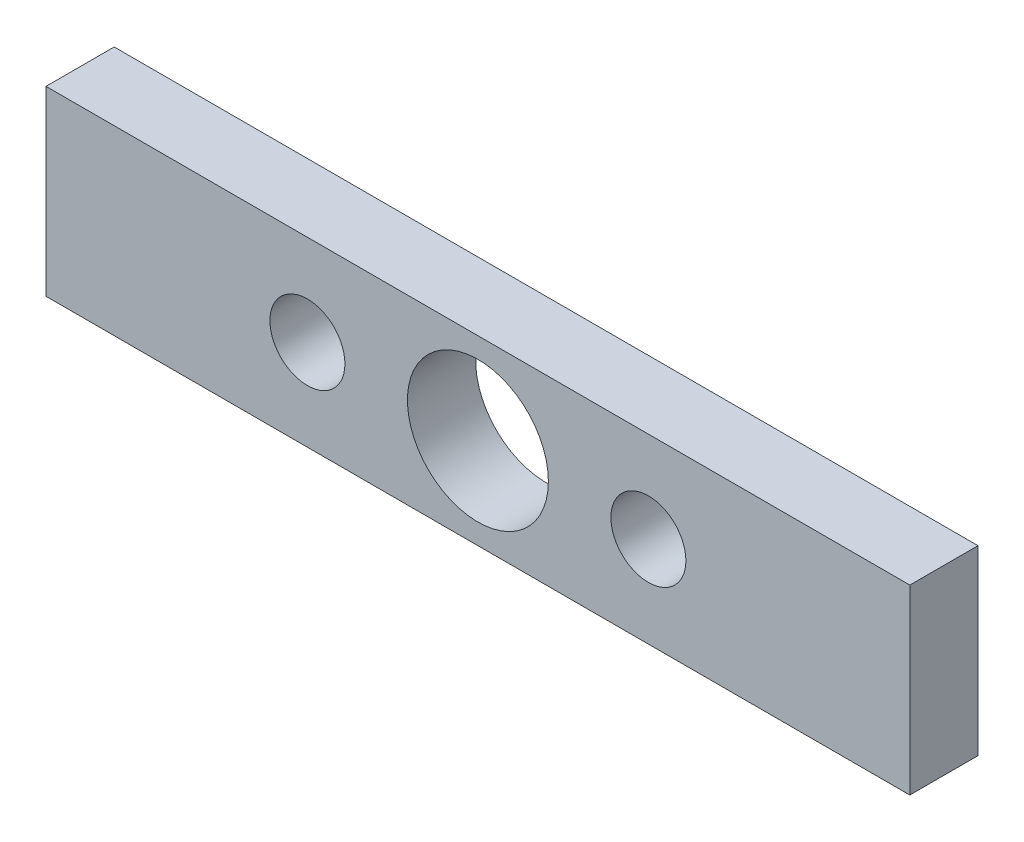
ISO-10303-21;
HEADER;
FILE_DESCRIPTION(('STEP AP214'),'2;1');
FILE_NAME('part.step','',(''),(''),'','','');
FILE_SCHEMA(('AUTOMOTIVE_DESIGN { 1 0 10303 214 1 1 1 1 }'));
ENDSEC;
DATA;
#1=APPLICATION_CONTEXT('core data for automotive mechanical design processes');
#2=APPLICATION_PROTOCOL_DEFINITION('international standard','automotive_design',2000,#1);
#3=PRODUCT_CONTEXT('',#1,'mechanical');
#4=PRODUCT('Part','Part','',(#3));
#5=PRODUCT_RELATED_PRODUCT_CATEGORY('part','',(#4));
#6=PRODUCT_DEFINITION_FORMATION('','',#4);
#7=PRODUCT_DEFINITION_CONTEXT('part definition',#1,'design');
#8=PRODUCT_DEFINITION('design','',#6,#7);
#9=PRODUCT_DEFINITION_SHAPE('','',#8);
#10=(LENGTH_UNIT() NAMED_UNIT(*) SI_UNIT(.MILLI.,.METRE.));
#11=(NAMED_UNIT(*) PLANE_ANGLE_UNIT() SI_UNIT($,.RADIAN.));
#12=(NAMED_UNIT(*) SI_UNIT($,.STERADIAN.) SOLID_ANGLE_UNIT());
#13=UNCERTAINTY_MEASURE_WITH_UNIT(LENGTH_MEASURE(1.E-05),#10,'distance_accuracy_value','');
#14=(GEOMETRIC_REPRESENTATION_CONTEXT(3) GLOBAL_UNCERTAINTY_ASSIGNED_CONTEXT((#13)) GLOBAL_UNIT_ASSIGNED_CONTEXT((#10,
#11,#12)) REPRESENTATION_CONTEXT('',''));
#15=CARTESIAN_POINT('',(0.,0.,0.));
#16=DIRECTION('',(0.,0.,1.));
#17=DIRECTION('',(1.,0.,0.));
#18=AXIS2_PLACEMENT_3D('',#15,#16,#17);
#19=CARTESIAN_POINT('',(-19.,0.,3.));
#20=DIRECTION('',(1.,0.,0.));
#21=DIRECTION('',(0.,0.,-1.));
#22=AXIS2_PLACEMENT_3D('',#19,#20,#21);
#23=PLANE('',#22);
#24=DIRECTION('',(0.,-1.,0.));
#25=VECTOR('',#24,1.);
#26=CARTESIAN_POINT('',(-19.,0.,0.));
#27=LINE('',#26,#25);
#28=CARTESIAN_POINT('',(-19.,8.,0.));
#29=VERTEX_POINT('',#28);
#30=CARTESIAN_POINT('',(-19.,0.,0.));
#31=VERTEX_POINT('',#30);
#32=EDGE_CURVE('E95',#29,#31,#27,.T.);
#33=ORIENTED_EDGE('',*,*,#32,.T.);
#34=DIRECTION('',(0.,0.,-1.));
#35=VECTOR('',#34,1.);
#36=CARTESIAN_POINT('',(-19.,0.,3.));
#37=LINE('',#36,#35);
#38=CARTESIAN_POINT('',(-19.,0.,3.));
#39=VERTEX_POINT('',#38);
#40=EDGE_CURVE('E11',#39,#31,#37,.T.);
#41=ORIENTED_EDGE('',*,*,#40,.F.);
#42=DIRECTION('',(0.,-1.,0.));
#43=VECTOR('',#42,1.);
#44=CARTESIAN_POINT('',(-19.,0.,3.));
#45=LINE('',#44,#43);
#46=CARTESIAN_POINT('',(-19.,8.,3.));
#47=VERTEX_POINT('',#46);
#48=EDGE_CURVE('E83',#47,#39,#45,.T.);
#49=ORIENTED_EDGE('',*,*,#48,.F.);
#50=DIRECTION('',(0.,0.,-1.));
#51=VECTOR('',#50,1.);
#52=CARTESIAN_POINT('',(-19.,8.,3.));
#53=LINE('',#52,#51);
#54=EDGE_CURVE('E91',#47,#29,#53,.T.);
#55=ORIENTED_EDGE('',*,*,#54,.T.);
#56=EDGE_LOOP('',(#33,#41,#49,#55));
#57=FACE_BOUND('',#56,.T.);
#58=ADVANCED_FACE('F32',(#57),#23,.F.);
#59=CARTESIAN_POINT('',(-19.,0.,3.));
#60=DIRECTION('',(0.,1.,0.));
#61=DIRECTION('',(0.,0.,1.));
#62=AXIS2_PLACEMENT_3D('',#59,#60,#61);
#63=PLANE('',#62);
#64=DIRECTION('',(1.,0.,0.));
#65=VECTOR('',#64,1.);
#66=CARTESIAN_POINT('',(-19.,0.,0.));
#67=LINE('',#66,#65);
#68=CARTESIAN_POINT('',(19.,0.,0.));
#69=VERTEX_POINT('',#68);
#70=EDGE_CURVE('E87',#31,#69,#67,.T.);
#71=ORIENTED_EDGE('',*,*,#70,.T.);
#72=DIRECTION('',(0.,0.,-1.));
#73=VECTOR('',#72,1.);
#74=CARTESIAN_POINT('',(19.,0.,3.));
#75=LINE('',#74,#73);
#76=CARTESIAN_POINT('',(19.,0.,3.));
#77=VERTEX_POINT('',#76);
#78=EDGE_CURVE('E40',#77,#69,#75,.T.);
#79=ORIENTED_EDGE('',*,*,#78,.F.);
#80=DIRECTION('',(1.,0.,0.));
#81=VECTOR('',#80,1.);
#82=CARTESIAN_POINT('',(-19.,0.,3.));
#83=LINE('',#82,#81);
#84=EDGE_CURVE('E78',#39,#77,#83,.T.);
#85=ORIENTED_EDGE('',*,*,#84,.F.);
#86=ORIENTED_EDGE('',*,*,#40,.T.);
#87=EDGE_LOOP('',(#71,#79,#85,#86));
#88=FACE_BOUND('',#87,.T.);
#89=ADVANCED_FACE('F86',(#88),#63,.F.);
#90=CARTESIAN_POINT('',(19.,0.,3.));
#91=DIRECTION('',(-1.,0.,0.));
#92=DIRECTION('',(0.,0.,1.));
#93=AXIS2_PLACEMENT_3D('',#90,#91,#92);
#94=PLANE('',#93);
#95=DIRECTION('',(0.,1.,0.));
#96=VECTOR('',#95,1.);
#97=CARTESIAN_POINT('',(19.,0.,0.));
#98=LINE('',#97,#96);
#99=CARTESIAN_POINT('',(19.,8.,0.));
#100=VERTEX_POINT('',#99);
#101=EDGE_CURVE('E65',#69,#100,#98,.T.);
#102=ORIENTED_EDGE('',*,*,#101,.T.);
#103=DIRECTION('',(0.,0.,-1.));
#104=VECTOR('',#103,1.);
#105=CARTESIAN_POINT('',(19.,8.,3.));
#106=LINE('',#105,#104);
#107=CARTESIAN_POINT('',(19.,8.,3.));
#108=VERTEX_POINT('',#107);
#109=EDGE_CURVE('E88',#108,#100,#106,.T.);
#110=ORIENTED_EDGE('',*,*,#109,.F.);
#111=DIRECTION('',(0.,1.,0.));
#112=VECTOR('',#111,1.);
#113=CARTESIAN_POINT('',(19.,0.,3.));
#114=LINE('',#113,#112);
#115=EDGE_CURVE('E81',#77,#108,#114,.T.);
#116=ORIENTED_EDGE('',*,*,#115,.F.);
#117=ORIENTED_EDGE('',*,*,#78,.T.);
#118=EDGE_LOOP('',(#102,#110,#116,#117));
#119=FACE_BOUND('',#118,.T.);
#120=ADVANCED_FACE('F89',(#119),#94,.F.);
#121=CARTESIAN_POINT('',(-19.,8.,3.));
#122=DIRECTION('',(0.,-1.,0.));
#123=DIRECTION('',(0.,0.,-1.));
#124=AXIS2_PLACEMENT_3D('',#121,#122,#123);
#125=PLANE('',#124);
#126=DIRECTION('',(-1.,0.,0.));
#127=VECTOR('',#126,1.);
#128=CARTESIAN_POINT('',(-19.,8.,0.));
#129=LINE('',#128,#127);
#130=EDGE_CURVE('E71',#100,#29,#129,.T.);
#131=ORIENTED_EDGE('',*,*,#130,.T.);
#132=ORIENTED_EDGE('',*,*,#54,.F.);
#133=DIRECTION('',(-1.,0.,0.));
#134=VECTOR('',#133,1.);
#135=CARTESIAN_POINT('',(-19.,8.,3.));
#136=LINE('',#135,#134);
#137=EDGE_CURVE('E48',#108,#47,#136,.T.);
#138=ORIENTED_EDGE('',*,*,#137,.F.);
#139=ORIENTED_EDGE('',*,*,#109,.T.);
#140=EDGE_LOOP('',(#131,#132,#138,#139));
#141=FACE_BOUND('',#140,.T.);
#142=ADVANCED_FACE('F103',(#141),#125,.F.);
#143=CARTESIAN_POINT('',(-19.,8.,3.));
#144=DIRECTION('',(0.,0.,-1.));
#145=DIRECTION('',(-1.,0.,0.));
#146=AXIS2_PLACEMENT_3D('',#143,#144,#145);
#147=PLANE('',#146);
#148=CARTESIAN_POINT('',(7.5,4.,3.));
#149=DIRECTION('',(0.,0.,1.));
#150=DIRECTION('',(1.,0.,0.));
#151=AXIS2_PLACEMENT_3D('',#148,#149,#150);
#152=CIRCLE('',#151,1.65);
#153=CARTESIAN_POINT('',(9.15,4.,3.));
#154=VERTEX_POINT('',#153);
#155=EDGE_CURVE('E121',#154,#154,#152,.T.);
#156=ORIENTED_EDGE('',*,*,#155,.F.);
#157=EDGE_LOOP('',(#156));
#158=FACE_BOUND('',#157,.T.);
#159=CARTESIAN_POINT('',(-7.5,4.,3.));
#160=DIRECTION('',(0.,0.,1.));
#161=DIRECTION('',(1.,0.,0.));
#162=AXIS2_PLACEMENT_3D('',#159,#160,#161);
#163=CIRCLE('',#162,1.65);
#164=CARTESIAN_POINT('',(-5.85,4.,3.));
#165=VERTEX_POINT('',#164);
#166=EDGE_CURVE('E115',#165,#165,#163,.T.);
#167=ORIENTED_EDGE('',*,*,#166,.F.);
#168=EDGE_LOOP('',(#167));
#169=FACE_BOUND('',#168,.T.);
#170=CARTESIAN_POINT('',(0.,4.,3.));
#171=DIRECTION('',(0.,0.,1.));
#172=DIRECTION('',(1.,0.,0.));
#173=AXIS2_PLACEMENT_3D('',#170,#171,#172);
#174=CIRCLE('',#173,3.1);
#175=CARTESIAN_POINT('',(3.1,4.,3.));
#176=VERTEX_POINT('',#175);
#177=EDGE_CURVE('E109',#176,#176,#174,.T.);
#178=ORIENTED_EDGE('',*,*,#177,.F.);
#179=EDGE_LOOP('',(#178));
#180=FACE_BOUND('',#179,.T.);
#181=ORIENTED_EDGE('',*,*,#48,.T.);
#182=ORIENTED_EDGE('',*,*,#84,.T.);
#183=ORIENTED_EDGE('',*,*,#115,.T.);
#184=ORIENTED_EDGE('',*,*,#137,.T.);
#185=EDGE_LOOP('',(#181,#182,#183,#184));
#186=FACE_BOUND('',#185,.T.);
#187=ADVANCED_FACE('F79',(#158,#169,#180,#186),#147,.F.);
#188=CARTESIAN_POINT('',(-19.,8.,0.));
#189=DIRECTION('',(0.,0.,-1.));
#190=DIRECTION('',(-1.,0.,0.));
#191=AXIS2_PLACEMENT_3D('',#188,#189,#190);
#192=PLANE('',#191);
#193=CARTESIAN_POINT('',(7.5,4.,0.));
#194=DIRECTION('',(0.,0.,1.));
#195=DIRECTION('',(1.,0.,0.));
#196=AXIS2_PLACEMENT_3D('',#193,#194,#195);
#197=CIRCLE('',#196,1.65);
#198=CARTESIAN_POINT('',(9.15,4.,0.));
#199=VERTEX_POINT('',#198);
#200=EDGE_CURVE('E118',#199,#199,#197,.T.);
#201=ORIENTED_EDGE('',*,*,#200,.T.);
#202=EDGE_LOOP('',(#201));
#203=FACE_BOUND('',#202,.T.);
#204=CARTESIAN_POINT('',(-7.5,4.,0.));
#205=DIRECTION('',(0.,0.,1.));
#206=DIRECTION('',(1.,0.,0.));
#207=AXIS2_PLACEMENT_3D('',#204,#205,#206);
#208=CIRCLE('',#207,1.65);
#209=CARTESIAN_POINT('',(-5.85,4.,0.));
#210=VERTEX_POINT('',#209);
#211=EDGE_CURVE('E112',#210,#210,#208,.T.);
#212=ORIENTED_EDGE('',*,*,#211,.T.);
#213=EDGE_LOOP('',(#212));
#214=FACE_BOUND('',#213,.T.);
#215=CARTESIAN_POINT('',(0.,4.,0.));
#216=DIRECTION('',(0.,0.,1.));
#217=DIRECTION('',(1.,0.,0.));
#218=AXIS2_PLACEMENT_3D('',#215,#216,#217);
#219=CIRCLE('',#218,3.1);
#220=CARTESIAN_POINT('',(3.1,4.,0.));
#221=VERTEX_POINT('',#220);
#222=EDGE_CURVE('E98',#221,#221,#219,.T.);
#223=ORIENTED_EDGE('',*,*,#222,.T.);
#224=EDGE_LOOP('',(#223));
#225=FACE_BOUND('',#224,.T.);
#226=ORIENTED_EDGE('',*,*,#32,.F.);
#227=ORIENTED_EDGE('',*,*,#130,.F.);
#228=ORIENTED_EDGE('',*,*,#101,.F.);
#229=ORIENTED_EDGE('',*,*,#70,.F.);
#230=EDGE_LOOP('',(#226,#227,#228,#229));
#231=FACE_BOUND('',#230,.T.);
#232=ADVANCED_FACE('F106',(#203,#214,#225,#231),#192,.T.);
#233=CARTESIAN_POINT('',(0.,4.,0.));
#234=DIRECTION('',(0.,0.,1.));
#235=DIRECTION('',(1.,0.,0.));
#236=AXIS2_PLACEMENT_3D('',#233,#234,#235);
#237=CYLINDRICAL_SURFACE('',#236,3.1);
#238=ORIENTED_EDGE('',*,*,#222,.F.);
#239=EDGE_LOOP('',(#238));
#240=FACE_BOUND('',#239,.T.);
#241=ORIENTED_EDGE('',*,*,#177,.T.);
#242=EDGE_LOOP('',(#241));
#243=FACE_BOUND('',#242,.T.);
#244=ADVANCED_FACE('F143',(#240,#243),#237,.F.);
#245=CARTESIAN_POINT('',(-7.5,4.,0.));
#246=DIRECTION('',(0.,0.,1.));
#247=DIRECTION('',(1.,0.,0.));
#248=AXIS2_PLACEMENT_3D('',#245,#246,#247);
#249=CYLINDRICAL_SURFACE('',#248,1.65);
#250=ORIENTED_EDGE('',*,*,#211,.F.);
#251=EDGE_LOOP('',(#250));
#252=FACE_BOUND('',#251,.T.);
#253=ORIENTED_EDGE('',*,*,#166,.T.);
#254=EDGE_LOOP('',(#253));
#255=FACE_BOUND('',#254,.T.);
#256=ADVANCED_FACE('F132',(#252,#255),#249,.F.);
#257=CARTESIAN_POINT('',(7.5,4.,0.));
#258=DIRECTION('',(0.,0.,1.));
#259=DIRECTION('',(1.,0.,0.));
#260=AXIS2_PLACEMENT_3D('',#257,#258,#259);
#261=CYLINDRICAL_SURFACE('',#260,1.65);
#262=ORIENTED_EDGE('',*,*,#200,.F.);
#263=EDGE_LOOP('',(#262));
#264=FACE_BOUND('',#263,.T.);
#265=ORIENTED_EDGE('',*,*,#155,.T.);
#266=EDGE_LOOP('',(#265));
#267=FACE_BOUND('',#266,.T.);
#268=ADVANCED_FACE('F129',(#264,#267),#261,.F.);
#269=CLOSED_SHELL('',(#58,#89,#120,#142,#187,#232,#244,#256,#268));
#270=MANIFOLD_SOLID_BREP('B2',#269);
#271=ADVANCED_BREP_SHAPE_REPRESENTATION('',(#18,#270),#14);
#272=SHAPE_DEFINITION_REPRESENTATION(#9,#271);
ENDSEC;
END-ISO-10303-21;
